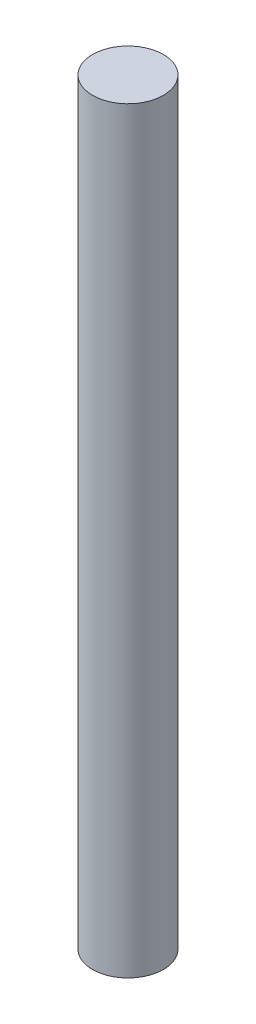
ISO-10303-21;
HEADER;
FILE_DESCRIPTION(('STEP AP214'),'2;1');
FILE_NAME('part.step','',(''),(''),'','','');
FILE_SCHEMA(('AUTOMOTIVE_DESIGN { 1 0 10303 214 1 1 1 1 }'));
ENDSEC;
DATA;
#1=APPLICATION_CONTEXT('core data for automotive mechanical design processes');
#2=APPLICATION_PROTOCOL_DEFINITION('international standard','automotive_design',2000,#1);
#3=PRODUCT_CONTEXT('',#1,'mechanical');
#4=PRODUCT('Part','Part','',(#3));
#5=PRODUCT_RELATED_PRODUCT_CATEGORY('part','',(#4));
#6=PRODUCT_DEFINITION_FORMATION('','',#4);
#7=PRODUCT_DEFINITION_CONTEXT('part definition',#1,'design');
#8=PRODUCT_DEFINITION('design','',#6,#7);
#9=PRODUCT_DEFINITION_SHAPE('','',#8);
#10=(LENGTH_UNIT() NAMED_UNIT(*) SI_UNIT(.MILLI.,.METRE.));
#11=(NAMED_UNIT(*) PLANE_ANGLE_UNIT() SI_UNIT($,.RADIAN.));
#12=(NAMED_UNIT(*) SI_UNIT($,.STERADIAN.) SOLID_ANGLE_UNIT());
#13=UNCERTAINTY_MEASURE_WITH_UNIT(LENGTH_MEASURE(1.E-05),#10,'distance_accuracy_value','');
#14=(GEOMETRIC_REPRESENTATION_CONTEXT(3) GLOBAL_UNCERTAINTY_ASSIGNED_CONTEXT((#13)) GLOBAL_UNIT_ASSIGNED_CONTEXT((#10,
#11,#12)) REPRESENTATION_CONTEXT('',''));
#15=CARTESIAN_POINT('',(0.,0.,0.));
#16=DIRECTION('',(0.,0.,1.));
#17=DIRECTION('',(1.,0.,0.));
#18=AXIS2_PLACEMENT_3D('',#15,#16,#17);
#19=CARTESIAN_POINT('',(0.,25.4,0.));
#20=DIRECTION('',(0.,-1.,0.));
#21=DIRECTION('',(0.,0.,-1.));
#22=AXIS2_PLACEMENT_3D('',#19,#20,#21);
#23=CYLINDRICAL_SURFACE('',#22,2.3749);
#24=CARTESIAN_POINT('',(0.,25.4,0.));
#25=DIRECTION('',(0.,1.,0.));
#26=DIRECTION('',(0.,0.,1.));
#27=AXIS2_PLACEMENT_3D('',#24,#25,#26);
#28=CIRCLE('',#27,2.3749);
#29=CARTESIAN_POINT('',(0.,25.4,2.3749));
#30=VERTEX_POINT('',#29);
#31=EDGE_CURVE('E10',#30,#30,#28,.T.);
#32=ORIENTED_EDGE('',*,*,#31,.F.);
#33=EDGE_LOOP('',(#32));
#34=FACE_BOUND('',#33,.T.);
#35=CARTESIAN_POINT('',(0.,-25.4,0.));
#36=DIRECTION('',(0.,1.,0.));
#37=DIRECTION('',(0.,0.,1.));
#38=AXIS2_PLACEMENT_3D('',#35,#36,#37);
#39=CIRCLE('',#38,2.3749);
#40=CARTESIAN_POINT('',(0.,-25.4,2.3749));
#41=VERTEX_POINT('',#40);
#42=EDGE_CURVE('E45',#41,#41,#39,.T.);
#43=ORIENTED_EDGE('',*,*,#42,.T.);
#44=EDGE_LOOP('',(#43));
#45=FACE_BOUND('',#44,.T.);
#46=ADVANCED_FACE('F39',(#34,#45),#23,.T.);
#47=CARTESIAN_POINT('',(0.,25.4,0.));
#48=DIRECTION('',(0.,1.,0.));
#49=DIRECTION('',(0.,0.,1.));
#50=AXIS2_PLACEMENT_3D('',#47,#48,#49);
#51=PLANE('',#50);
#52=ORIENTED_EDGE('',*,*,#31,.T.);
#53=EDGE_LOOP('',(#52));
#54=FACE_BOUND('',#53,.T.);
#55=ADVANCED_FACE('F54',(#54),#51,.T.);
#56=CARTESIAN_POINT('',(0.,-25.4,0.));
#57=DIRECTION('',(0.,1.,0.));
#58=DIRECTION('',(0.,0.,1.));
#59=AXIS2_PLACEMENT_3D('',#56,#57,#58);
#60=PLANE('',#59);
#61=ORIENTED_EDGE('',*,*,#42,.F.);
#62=EDGE_LOOP('',(#61));
#63=FACE_BOUND('',#62,.T.);
#64=ADVANCED_FACE('F52',(#63),#60,.F.);
#65=CLOSED_SHELL('',(#46,#55,#64));
#66=MANIFOLD_SOLID_BREP('B2',#65);
#67=ADVANCED_BREP_SHAPE_REPRESENTATION('',(#18,#66),#14);
#68=SHAPE_DEFINITION_REPRESENTATION(#9,#67);
ENDSEC;
END-ISO-10303-21;
